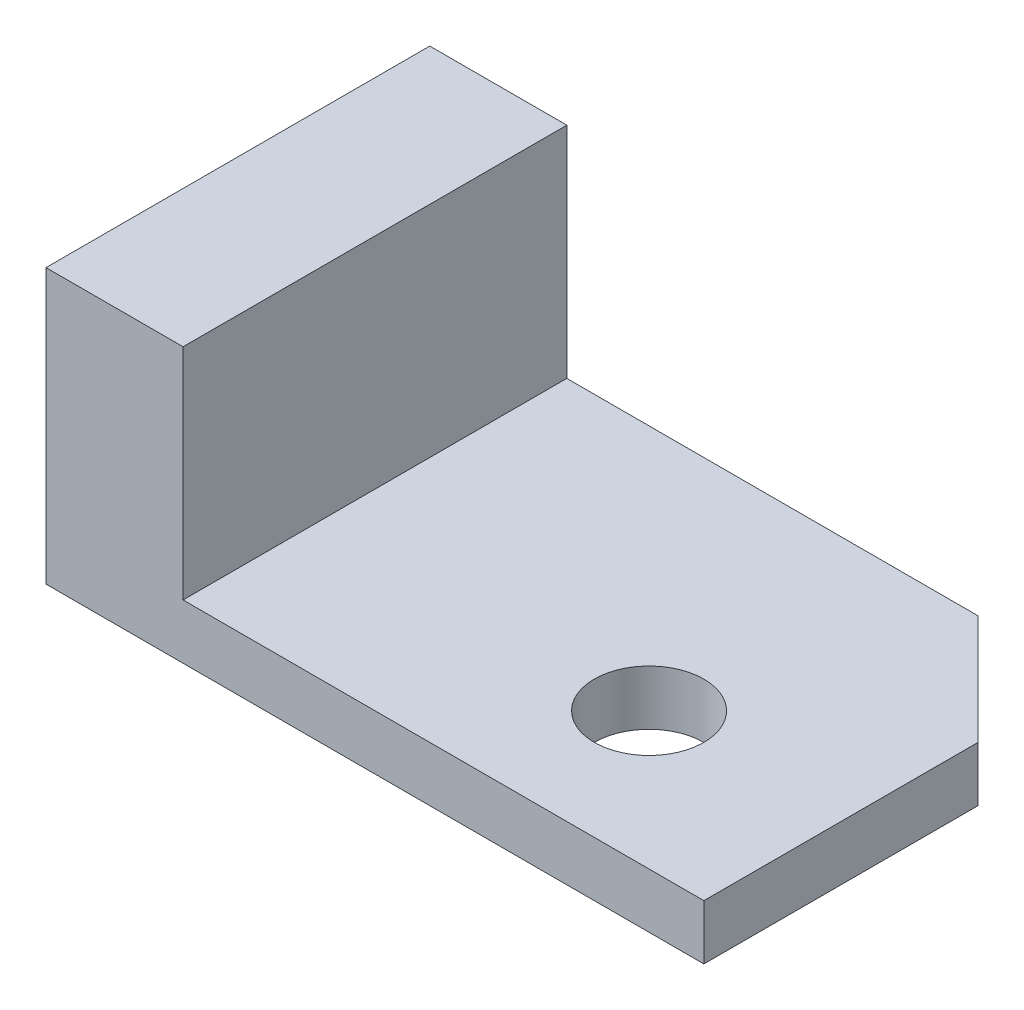
ISO-10303-21;
HEADER;
FILE_DESCRIPTION(('STEP AP214'),'2;1');
FILE_NAME('part.step','',(''),(''),'','','');
FILE_SCHEMA(('AUTOMOTIVE_DESIGN { 1 0 10303 214 1 1 1 1 }'));
ENDSEC;
DATA;
#1=APPLICATION_CONTEXT('core data for automotive mechanical design processes');
#2=APPLICATION_PROTOCOL_DEFINITION('international standard','automotive_design',2000,#1);
#3=PRODUCT_CONTEXT('',#1,'mechanical');
#4=PRODUCT('Part','Part','',(#3));
#5=PRODUCT_RELATED_PRODUCT_CATEGORY('part','',(#4));
#6=PRODUCT_DEFINITION_FORMATION('','',#4);
#7=PRODUCT_DEFINITION_CONTEXT('part definition',#1,'design');
#8=PRODUCT_DEFINITION('design','',#6,#7);
#9=PRODUCT_DEFINITION_SHAPE('','',#8);
#10=(LENGTH_UNIT() NAMED_UNIT(*) SI_UNIT(.MILLI.,.METRE.));
#11=(NAMED_UNIT(*) PLANE_ANGLE_UNIT() SI_UNIT($,.RADIAN.));
#12=(NAMED_UNIT(*) SI_UNIT($,.STERADIAN.) SOLID_ANGLE_UNIT());
#13=UNCERTAINTY_MEASURE_WITH_UNIT(LENGTH_MEASURE(1.E-05),#10,'distance_accuracy_value','');
#14=(GEOMETRIC_REPRESENTATION_CONTEXT(3) GLOBAL_UNCERTAINTY_ASSIGNED_CONTEXT((#13)) GLOBAL_UNIT_ASSIGNED_CONTEXT((#10,
#11,#12)) REPRESENTATION_CONTEXT('',''));
#15=CARTESIAN_POINT('',(0.,0.,0.));
#16=DIRECTION('',(0.,0.,1.));
#17=DIRECTION('',(1.,0.,0.));
#18=AXIS2_PLACEMENT_3D('',#15,#16,#17);
#19=CARTESIAN_POINT('',(0.,10.,0.));
#20=DIRECTION('',(0.,-1.,0.));
#21=DIRECTION('',(0.,0.,-1.));
#22=AXIS2_PLACEMENT_3D('',#19,#20,#21);
#23=PLANE('',#22);
#24=CARTESIAN_POINT('',(85.,10.,-25.));
#25=DIRECTION('',(0.,-1.,0.));
#26=DIRECTION('',(0.,0.,-1.));
#27=AXIS2_PLACEMENT_3D('',#24,#25,#26);
#28=CIRCLE('',#27,9.99999999999999);
#29=CARTESIAN_POINT('',(85.,10.,-35.));
#30=VERTEX_POINT('',#29);
#31=EDGE_CURVE('E132',#30,#30,#28,.F.);
#32=ORIENTED_EDGE('',*,*,#31,.F.);
#33=EDGE_LOOP('',(#32));
#34=FACE_BOUND('',#33,.T.);
#35=DIRECTION('',(0.,0.,-1.));
#36=VECTOR('',#35,1.);
#37=CARTESIAN_POINT('',(120.,10.,0.));
#38=LINE('',#37,#36);
#39=CARTESIAN_POINT('',(120.,10.,0.));
#40=VERTEX_POINT('',#39);
#41=CARTESIAN_POINT('',(120.,10.,-50.));
#42=VERTEX_POINT('',#41);
#43=EDGE_CURVE('E145',#40,#42,#38,.T.);
#44=ORIENTED_EDGE('',*,*,#43,.T.);
#45=DIRECTION('',(0.707106781186548,0.,0.707106781186547));
#46=VECTOR('',#45,1.);
#47=CARTESIAN_POINT('',(99.9999999999999,10.,-70.));
#48=LINE('',#47,#46);
#49=CARTESIAN_POINT('',(99.9999999999999,10.,-70.));
#50=VERTEX_POINT('',#49);
#51=EDGE_CURVE('E11',#42,#50,#48,.F.);
#52=ORIENTED_EDGE('',*,*,#51,.T.);
#53=DIRECTION('',(-1.,0.,0.));
#54=VECTOR('',#53,1.);
#55=CARTESIAN_POINT('',(0.,10.,-70.));
#56=LINE('',#55,#54);
#57=CARTESIAN_POINT('',(25.,10.,-70.));
#58=VERTEX_POINT('',#57);
#59=EDGE_CURVE('E150',#50,#58,#56,.T.);
#60=ORIENTED_EDGE('',*,*,#59,.T.);
#61=DIRECTION('',(0.,0.,-1.));
#62=VECTOR('',#61,1.);
#63=CARTESIAN_POINT('',(25.,10.,0.));
#64=LINE('',#63,#62);
#65=CARTESIAN_POINT('',(25.,10.,0.));
#66=VERTEX_POINT('',#65);
#67=EDGE_CURVE('E126',#66,#58,#64,.T.);
#68=ORIENTED_EDGE('',*,*,#67,.F.);
#69=DIRECTION('',(1.,0.,0.));
#70=VECTOR('',#69,1.);
#71=CARTESIAN_POINT('',(0.,10.,0.));
#72=LINE('',#71,#70);
#73=EDGE_CURVE('E142',#66,#40,#72,.T.);
#74=ORIENTED_EDGE('',*,*,#73,.T.);
#75=EDGE_LOOP('',(#44,#52,#60,#68,#74));
#76=FACE_BOUND('',#75,.T.);
#77=ADVANCED_FACE('F41',(#34,#76),#23,.F.);
#78=CARTESIAN_POINT('',(0.,10.,0.));
#79=DIRECTION('',(1.,0.,0.));
#80=DIRECTION('',(0.,0.,-1.));
#81=AXIS2_PLACEMENT_3D('',#78,#79,#80);
#82=PLANE('',#81);
#83=DIRECTION('',(0.,0.,1.));
#84=VECTOR('',#83,1.);
#85=CARTESIAN_POINT('',(0.,0.,0.));
#86=LINE('',#85,#84);
#87=CARTESIAN_POINT('',(0.,0.,-70.));
#88=VERTEX_POINT('',#87);
#89=CARTESIAN_POINT('',(0.,0.,0.));
#90=VERTEX_POINT('',#89);
#91=EDGE_CURVE('E108',#88,#90,#86,.T.);
#92=ORIENTED_EDGE('',*,*,#91,.T.);
#93=DIRECTION('',(0.,-1.,0.));
#94=VECTOR('',#93,1.);
#95=CARTESIAN_POINT('',(0.,10.,0.));
#96=LINE('',#95,#94);
#97=CARTESIAN_POINT('',(0.,50.,0.));
#98=VERTEX_POINT('',#97);
#99=EDGE_CURVE('E105',#98,#90,#96,.T.);
#100=ORIENTED_EDGE('',*,*,#99,.F.);
#101=DIRECTION('',(0.,0.,1.));
#102=VECTOR('',#101,1.);
#103=CARTESIAN_POINT('',(0.,50.,0.));
#104=LINE('',#103,#102);
#105=CARTESIAN_POINT('',(0.,50.,-70.));
#106=VERTEX_POINT('',#105);
#107=EDGE_CURVE('E110',#106,#98,#104,.T.);
#108=ORIENTED_EDGE('',*,*,#107,.F.);
#109=DIRECTION('',(0.,-1.,0.));
#110=VECTOR('',#109,1.);
#111=CARTESIAN_POINT('',(0.,10.,-70.));
#112=LINE('',#111,#110);
#113=EDGE_CURVE('E149',#106,#88,#112,.T.);
#114=ORIENTED_EDGE('',*,*,#113,.T.);
#115=EDGE_LOOP('',(#92,#100,#108,#114));
#116=FACE_BOUND('',#115,.T.);
#117=ADVANCED_FACE('F102',(#116),#82,.F.);
#118=CARTESIAN_POINT('',(0.,10.,0.));
#119=DIRECTION('',(0.,0.,-1.));
#120=DIRECTION('',(-1.,0.,0.));
#121=AXIS2_PLACEMENT_3D('',#118,#119,#120);
#122=PLANE('',#121);
#123=DIRECTION('',(1.,0.,0.));
#124=VECTOR('',#123,1.);
#125=CARTESIAN_POINT('',(0.,0.,0.));
#126=LINE('',#125,#124);
#127=CARTESIAN_POINT('',(120.,0.,0.));
#128=VERTEX_POINT('',#127);
#129=EDGE_CURVE('E151',#90,#128,#126,.T.);
#130=ORIENTED_EDGE('',*,*,#129,.T.);
#131=DIRECTION('',(0.,-1.,0.));
#132=VECTOR('',#131,1.);
#133=CARTESIAN_POINT('',(120.,10.,0.));
#134=LINE('',#133,#132);
#135=EDGE_CURVE('E115',#40,#128,#134,.T.);
#136=ORIENTED_EDGE('',*,*,#135,.F.);
#137=ORIENTED_EDGE('',*,*,#73,.F.);
#138=DIRECTION('',(0.,-1.,0.));
#139=VECTOR('',#138,1.);
#140=CARTESIAN_POINT('',(25.,50.,0.));
#141=LINE('',#140,#139);
#142=CARTESIAN_POINT('',(25.,50.,0.));
#143=VERTEX_POINT('',#142);
#144=EDGE_CURVE('E116',#143,#66,#141,.T.);
#145=ORIENTED_EDGE('',*,*,#144,.F.);
#146=DIRECTION('',(1.,0.,0.));
#147=VECTOR('',#146,1.);
#148=CARTESIAN_POINT('',(0.,50.,0.));
#149=LINE('',#148,#147);
#150=EDGE_CURVE('E113',#98,#143,#149,.T.);
#151=ORIENTED_EDGE('',*,*,#150,.F.);
#152=ORIENTED_EDGE('',*,*,#99,.T.);
#153=EDGE_LOOP('',(#130,#136,#137,#145,#151,#152));
#154=FACE_BOUND('',#153,.T.);
#155=ADVANCED_FACE('F117',(#154),#122,.F.);
#156=CARTESIAN_POINT('',(120.,10.,0.));
#157=DIRECTION('',(-1.,0.,0.));
#158=DIRECTION('',(0.,0.,1.));
#159=AXIS2_PLACEMENT_3D('',#156,#157,#158);
#160=PLANE('',#159);
#161=DIRECTION('',(0.,0.,-1.));
#162=VECTOR('',#161,1.);
#163=CARTESIAN_POINT('',(120.,0.,0.));
#164=LINE('',#163,#162);
#165=CARTESIAN_POINT('',(120.,0.,-50.));
#166=VERTEX_POINT('',#165);
#167=EDGE_CURVE('E153',#128,#166,#164,.T.);
#168=ORIENTED_EDGE('',*,*,#167,.T.);
#169=DIRECTION('',(0.,1.,0.));
#170=VECTOR('',#169,1.);
#171=CARTESIAN_POINT('',(120.,10.,-50.));
#172=LINE('',#171,#170);
#173=EDGE_CURVE('E49',#166,#42,#172,.T.);
#174=ORIENTED_EDGE('',*,*,#173,.T.);
#175=ORIENTED_EDGE('',*,*,#43,.F.);
#176=ORIENTED_EDGE('',*,*,#135,.T.);
#177=EDGE_LOOP('',(#168,#174,#175,#176));
#178=FACE_BOUND('',#177,.T.);
#179=ADVANCED_FACE('F166',(#178),#160,.F.);
#180=CARTESIAN_POINT('',(0.,10.,-70.));
#181=DIRECTION('',(0.,0.,1.));
#182=DIRECTION('',(1.,0.,0.));
#183=AXIS2_PLACEMENT_3D('',#180,#181,#182);
#184=PLANE('',#183);
#185=ORIENTED_EDGE('',*,*,#59,.F.);
#186=DIRECTION('',(0.,-1.,0.));
#187=VECTOR('',#186,1.);
#188=CARTESIAN_POINT('',(99.9999999999999,10.,-70.));
#189=LINE('',#188,#187);
#190=CARTESIAN_POINT('',(99.9999999999999,0.,-70.));
#191=VERTEX_POINT('',#190);
#192=EDGE_CURVE('E112',#50,#191,#189,.T.);
#193=ORIENTED_EDGE('',*,*,#192,.T.);
#194=DIRECTION('',(-1.,0.,0.));
#195=VECTOR('',#194,1.);
#196=CARTESIAN_POINT('',(0.,0.,-70.));
#197=LINE('',#196,#195);
#198=EDGE_CURVE('E144',#191,#88,#197,.T.);
#199=ORIENTED_EDGE('',*,*,#198,.T.);
#200=ORIENTED_EDGE('',*,*,#113,.F.);
#201=DIRECTION('',(-1.,0.,0.));
#202=VECTOR('',#201,1.);
#203=CARTESIAN_POINT('',(0.,50.,-70.));
#204=LINE('',#203,#202);
#205=CARTESIAN_POINT('',(25.,50.,-70.));
#206=VERTEX_POINT('',#205);
#207=EDGE_CURVE('E130',#206,#106,#204,.T.);
#208=ORIENTED_EDGE('',*,*,#207,.F.);
#209=DIRECTION('',(0.,-1.,0.));
#210=VECTOR('',#209,1.);
#211=CARTESIAN_POINT('',(25.,50.,-70.));
#212=LINE('',#211,#210);
#213=EDGE_CURVE('E137',#206,#58,#212,.T.);
#214=ORIENTED_EDGE('',*,*,#213,.T.);
#215=EDGE_LOOP('',(#185,#193,#199,#200,#208,#214));
#216=FACE_BOUND('',#215,.T.);
#217=ADVANCED_FACE('F163',(#216),#184,.F.);
#218=CARTESIAN_POINT('',(0.,0.,0.));
#219=DIRECTION('',(0.,-1.,0.));
#220=DIRECTION('',(0.,0.,-1.));
#221=AXIS2_PLACEMENT_3D('',#218,#219,#220);
#222=PLANE('',#221);
#223=CARTESIAN_POINT('',(85.,0.,-25.));
#224=DIRECTION('',(0.,1.,0.));
#225=DIRECTION('',(0.,0.,1.));
#226=AXIS2_PLACEMENT_3D('',#223,#224,#225);
#227=CIRCLE('',#226,9.99999999999999);
#228=CARTESIAN_POINT('',(85.,0.,-15.));
#229=VERTEX_POINT('',#228);
#230=EDGE_CURVE('E268',#229,#229,#227,.T.);
#231=ORIENTED_EDGE('',*,*,#230,.T.);
#232=EDGE_LOOP('',(#231));
#233=FACE_BOUND('',#232,.T.);
#234=ORIENTED_EDGE('',*,*,#198,.F.);
#235=DIRECTION('',(-0.707106781186548,0.,-0.707106781186547));
#236=VECTOR('',#235,1.);
#237=CARTESIAN_POINT('',(84.9999999999999,0.,-85.));
#238=LINE('',#237,#236);
#239=EDGE_CURVE('E61',#191,#166,#238,.F.);
#240=ORIENTED_EDGE('',*,*,#239,.T.);
#241=ORIENTED_EDGE('',*,*,#167,.F.);
#242=ORIENTED_EDGE('',*,*,#129,.F.);
#243=ORIENTED_EDGE('',*,*,#91,.F.);
#244=EDGE_LOOP('',(#234,#240,#241,#242,#243));
#245=FACE_BOUND('',#244,.T.);
#246=ADVANCED_FACE('F170',(#233,#245),#222,.T.);
#247=CARTESIAN_POINT('',(25.,50.,0.));
#248=DIRECTION('',(-1.,0.,0.));
#249=DIRECTION('',(0.,0.,1.));
#250=AXIS2_PLACEMENT_3D('',#247,#248,#249);
#251=PLANE('',#250);
#252=ORIENTED_EDGE('',*,*,#67,.T.);
#253=ORIENTED_EDGE('',*,*,#213,.F.);
#254=DIRECTION('',(0.,0.,-1.));
#255=VECTOR('',#254,1.);
#256=CARTESIAN_POINT('',(25.,50.,0.));
#257=LINE('',#256,#255);
#258=EDGE_CURVE('E122',#143,#206,#257,.T.);
#259=ORIENTED_EDGE('',*,*,#258,.F.);
#260=ORIENTED_EDGE('',*,*,#144,.T.);
#261=EDGE_LOOP('',(#252,#253,#259,#260));
#262=FACE_BOUND('',#261,.T.);
#263=ADVANCED_FACE('F186',(#262),#251,.F.);
#264=CARTESIAN_POINT('',(0.,50.,0.));
#265=DIRECTION('',(0.,-1.,0.));
#266=DIRECTION('',(0.,0.,-1.));
#267=AXIS2_PLACEMENT_3D('',#264,#265,#266);
#268=PLANE('',#267);
#269=ORIENTED_EDGE('',*,*,#107,.T.);
#270=ORIENTED_EDGE('',*,*,#150,.T.);
#271=ORIENTED_EDGE('',*,*,#258,.T.);
#272=ORIENTED_EDGE('',*,*,#207,.T.);
#273=EDGE_LOOP('',(#269,#270,#271,#272));
#274=FACE_BOUND('',#273,.T.);
#275=ADVANCED_FACE('F125',(#274),#268,.F.);
#276=CARTESIAN_POINT('',(85.,50.,-25.));
#277=DIRECTION('',(0.,-1.,0.));
#278=DIRECTION('',(0.,0.,-1.));
#279=AXIS2_PLACEMENT_3D('',#276,#277,#278);
#280=CYLINDRICAL_SURFACE('',#279,9.99999999999999);
#281=ORIENTED_EDGE('',*,*,#230,.F.);
#282=EDGE_LOOP('',(#281));
#283=FACE_BOUND('',#282,.T.);
#284=ORIENTED_EDGE('',*,*,#31,.T.);
#285=EDGE_LOOP('',(#284));
#286=FACE_BOUND('',#285,.T.);
#287=ADVANCED_FACE('F175',(#283,#286),#280,.F.);
#288=CARTESIAN_POINT('',(99.9999999999999,10.,-70.));
#289=DIRECTION('',(-0.707106781186547,0.,0.707106781186548));
#290=DIRECTION('',(0.,-1.,0.));
#291=AXIS2_PLACEMENT_3D('',#288,#289,#290);
#292=PLANE('',#291);
#293=ORIENTED_EDGE('',*,*,#51,.F.);
#294=ORIENTED_EDGE('',*,*,#173,.F.);
#295=ORIENTED_EDGE('',*,*,#239,.F.);
#296=ORIENTED_EDGE('',*,*,#192,.F.);
#297=EDGE_LOOP('',(#293,#294,#295,#296));
#298=FACE_BOUND('',#297,.T.);
#299=ADVANCED_FACE('F42',(#298),#292,.F.);
#300=CLOSED_SHELL('',(#77,#117,#155,#179,#217,#246,#263,#275,#287,#299));
#301=MANIFOLD_SOLID_BREP('B2',#300);
#302=ADVANCED_BREP_SHAPE_REPRESENTATION('',(#18,#301),#14);
#303=SHAPE_DEFINITION_REPRESENTATION(#9,#302);
ENDSEC;
END-ISO-10303-21;
